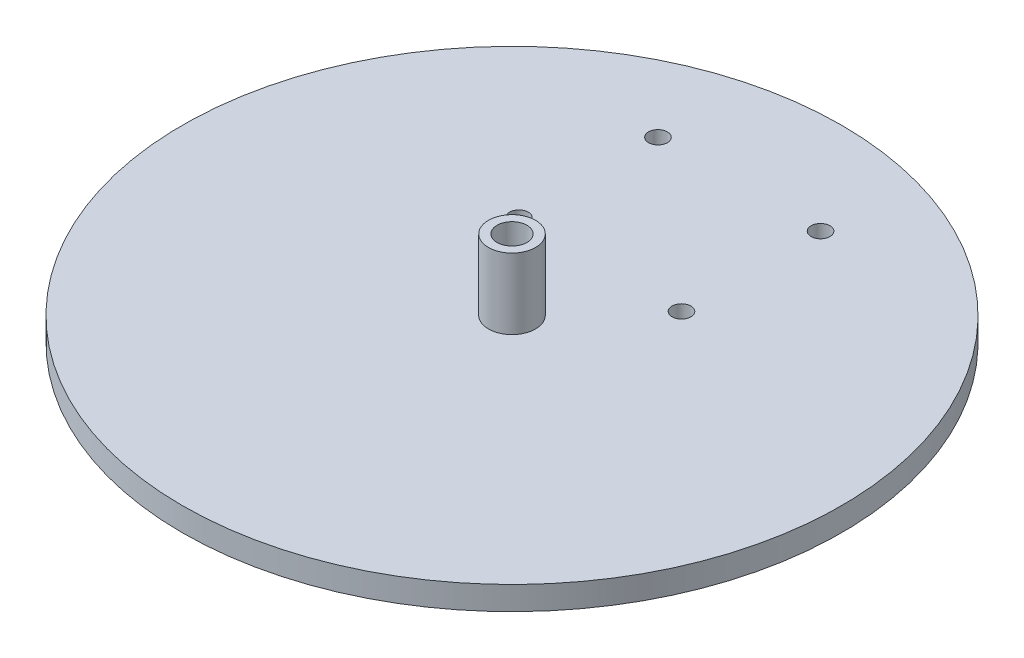
ISO-10303-21;
HEADER;
FILE_DESCRIPTION(('STEP AP214'),'2;1');
FILE_NAME('part.step','',(''),(''),'','','');
FILE_SCHEMA(('AUTOMOTIVE_DESIGN { 1 0 10303 214 1 1 1 1 }'));
ENDSEC;
DATA;
#1=APPLICATION_CONTEXT('core data for automotive mechanical design processes');
#2=APPLICATION_PROTOCOL_DEFINITION('international standard','automotive_design',2000,#1);
#3=PRODUCT_CONTEXT('',#1,'mechanical');
#4=PRODUCT('Part','Part','',(#3));
#5=PRODUCT_RELATED_PRODUCT_CATEGORY('part','',(#4));
#6=PRODUCT_DEFINITION_FORMATION('','',#4);
#7=PRODUCT_DEFINITION_CONTEXT('part definition',#1,'design');
#8=PRODUCT_DEFINITION('design','',#6,#7);
#9=PRODUCT_DEFINITION_SHAPE('','',#8);
#10=(LENGTH_UNIT() NAMED_UNIT(*) SI_UNIT(.MILLI.,.METRE.));
#11=(NAMED_UNIT(*) PLANE_ANGLE_UNIT() SI_UNIT($,.RADIAN.));
#12=(NAMED_UNIT(*) SI_UNIT($,.STERADIAN.) SOLID_ANGLE_UNIT());
#13=UNCERTAINTY_MEASURE_WITH_UNIT(LENGTH_MEASURE(1.E-05),#10,'distance_accuracy_value','');
#14=(GEOMETRIC_REPRESENTATION_CONTEXT(3) GLOBAL_UNCERTAINTY_ASSIGNED_CONTEXT((#13)) GLOBAL_UNIT_ASSIGNED_CONTEXT((#10,
#11,#12)) REPRESENTATION_CONTEXT('',''));
#15=CARTESIAN_POINT('',(0.,0.,0.));
#16=DIRECTION('',(0.,0.,1.));
#17=DIRECTION('',(1.,0.,0.));
#18=AXIS2_PLACEMENT_3D('',#15,#16,#17);
#19=CARTESIAN_POINT('',(0.,5.,0.));
#20=DIRECTION('',(0.,1.,0.));
#21=DIRECTION('',(0.,0.,1.));
#22=AXIS2_PLACEMENT_3D('',#19,#20,#21);
#23=PLANE('',#22);
#24=CARTESIAN_POINT('',(-17.2677669529664,5.,-18.7322330470337));
#25=DIRECTION('',(0.,1.,0.));
#26=DIRECTION('',(0.,0.,1.));
#27=AXIS2_PLACEMENT_3D('',#24,#25,#26);
#28=CIRCLE('',#27,2.);
#29=CARTESIAN_POINT('',(-17.2677669529664,5.,-16.7322330470337));
#30=VERTEX_POINT('',#29);
#31=EDGE_CURVE('E117',#30,#30,#28,.F.);
#32=ORIENTED_EDGE('',*,*,#31,.T.);
#33=EDGE_LOOP('',(#32));
#34=FACE_BOUND('',#33,.T.);
#35=CARTESIAN_POINT('',(17.2677669529664,5.,-18.7322330470337));
#36=DIRECTION('',(0.,1.,0.));
#37=DIRECTION('',(0.,0.,1.));
#38=AXIS2_PLACEMENT_3D('',#35,#36,#37);
#39=CIRCLE('',#38,2.);
#40=CARTESIAN_POINT('',(17.2677669529664,5.,-16.7322330470337));
#41=VERTEX_POINT('',#40);
#42=EDGE_CURVE('E121',#41,#41,#39,.T.);
#43=ORIENTED_EDGE('',*,*,#42,.F.);
#44=EDGE_LOOP('',(#43));
#45=FACE_BOUND('',#44,.T.);
#46=CARTESIAN_POINT('',(-17.2677669529664,5.,-48.2677669529663));
#47=DIRECTION('',(0.,1.,0.));
#48=DIRECTION('',(0.,0.,1.));
#49=AXIS2_PLACEMENT_3D('',#46,#47,#48);
#50=CIRCLE('',#49,2.);
#51=CARTESIAN_POINT('',(-17.2677669529664,5.,-46.2677669529663));
#52=VERTEX_POINT('',#51);
#53=EDGE_CURVE('E65',#52,#52,#50,.T.);
#54=ORIENTED_EDGE('',*,*,#53,.F.);
#55=EDGE_LOOP('',(#54));
#56=FACE_BOUND('',#55,.T.);
#57=CARTESIAN_POINT('',(0.,5.,0.));
#58=DIRECTION('',(0.,1.,0.));
#59=DIRECTION('',(0.,0.,1.));
#60=AXIS2_PLACEMENT_3D('',#57,#58,#59);
#61=CIRCLE('',#60,70.);
#62=CARTESIAN_POINT('',(0.,5.,70.));
#63=VERTEX_POINT('',#62);
#64=EDGE_CURVE('E10',#63,#63,#61,.T.);
#65=ORIENTED_EDGE('',*,*,#64,.T.);
#66=EDGE_LOOP('',(#65));
#67=FACE_BOUND('',#66,.T.);
#68=CARTESIAN_POINT('',(0.,5.,0.));
#69=DIRECTION('',(0.,1.,0.));
#70=DIRECTION('',(0.,0.,1.));
#71=AXIS2_PLACEMENT_3D('',#68,#69,#70);
#72=CIRCLE('',#71,5.);
#73=CARTESIAN_POINT('',(0.,5.,5.));
#74=VERTEX_POINT('',#73);
#75=EDGE_CURVE('E76',#74,#74,#72,.T.);
#76=ORIENTED_EDGE('',*,*,#75,.F.);
#77=EDGE_LOOP('',(#76));
#78=FACE_BOUND('',#77,.T.);
#79=CARTESIAN_POINT('',(17.2677669529664,5.,-48.2677669529663));
#80=DIRECTION('',(0.,1.,0.));
#81=DIRECTION('',(0.,0.,1.));
#82=AXIS2_PLACEMENT_3D('',#79,#80,#81);
#83=CIRCLE('',#82,2.);
#84=CARTESIAN_POINT('',(17.2677669529664,5.,-46.2677669529663));
#85=VERTEX_POINT('',#84);
#86=EDGE_CURVE('E129',#85,#85,#83,.F.);
#87=ORIENTED_EDGE('',*,*,#86,.T.);
#88=EDGE_LOOP('',(#87));
#89=FACE_BOUND('',#88,.T.);
#90=ADVANCED_FACE('F43',(#34,#45,#56,#67,#78,#89),#23,.T.);
#91=CARTESIAN_POINT('',(0.,0.,0.));
#92=DIRECTION('',(0.,1.,0.));
#93=DIRECTION('',(0.,0.,1.));
#94=AXIS2_PLACEMENT_3D('',#91,#92,#93);
#95=PLANE('',#94);
#96=CARTESIAN_POINT('',(17.2677669529664,0.,-18.7322330470337));
#97=DIRECTION('',(0.,1.,0.));
#98=DIRECTION('',(0.,0.,1.));
#99=AXIS2_PLACEMENT_3D('',#96,#97,#98);
#100=CIRCLE('',#99,2.);
#101=CARTESIAN_POINT('',(17.2677669529664,0.,-16.7322330470337));
#102=VERTEX_POINT('',#101);
#103=EDGE_CURVE('E64',#102,#102,#100,.T.);
#104=ORIENTED_EDGE('',*,*,#103,.T.);
#105=EDGE_LOOP('',(#104));
#106=FACE_BOUND('',#105,.T.);
#107=CARTESIAN_POINT('',(-17.2677669529664,0.,-48.2677669529663));
#108=DIRECTION('',(0.,1.,0.));
#109=DIRECTION('',(0.,0.,1.));
#110=AXIS2_PLACEMENT_3D('',#107,#108,#109);
#111=CIRCLE('',#110,2.);
#112=CARTESIAN_POINT('',(-17.2677669529664,0.,-46.2677669529663));
#113=VERTEX_POINT('',#112);
#114=EDGE_CURVE('E61',#113,#113,#111,.T.);
#115=ORIENTED_EDGE('',*,*,#114,.T.);
#116=EDGE_LOOP('',(#115));
#117=FACE_BOUND('',#116,.T.);
#118=CARTESIAN_POINT('',(0.,0.,0.));
#119=DIRECTION('',(0.,1.,0.));
#120=DIRECTION('',(0.,0.,1.));
#121=AXIS2_PLACEMENT_3D('',#118,#119,#120);
#122=CIRCLE('',#121,70.);
#123=CARTESIAN_POINT('',(0.,0.,70.));
#124=VERTEX_POINT('',#123);
#125=EDGE_CURVE('E51',#124,#124,#122,.T.);
#126=ORIENTED_EDGE('',*,*,#125,.F.);
#127=EDGE_LOOP('',(#126));
#128=FACE_BOUND('',#127,.T.);
#129=CARTESIAN_POINT('',(0.,0.,0.));
#130=DIRECTION('',(0.,1.,0.));
#131=DIRECTION('',(0.,0.,1.));
#132=AXIS2_PLACEMENT_3D('',#129,#130,#131);
#133=CIRCLE('',#132,3.175);
#134=CARTESIAN_POINT('',(0.,0.,3.175));
#135=VERTEX_POINT('',#134);
#136=EDGE_CURVE('E56',#135,#135,#133,.T.);
#137=ORIENTED_EDGE('',*,*,#136,.T.);
#138=EDGE_LOOP('',(#137));
#139=FACE_BOUND('',#138,.T.);
#140=CARTESIAN_POINT('',(-17.2677669529664,0.,-18.7322330470337));
#141=DIRECTION('',(0.,1.,0.));
#142=DIRECTION('',(0.,0.,1.));
#143=AXIS2_PLACEMENT_3D('',#140,#141,#142);
#144=CIRCLE('',#143,2.);
#145=CARTESIAN_POINT('',(-17.2677669529664,0.,-16.7322330470337));
#146=VERTEX_POINT('',#145);
#147=EDGE_CURVE('E67',#146,#146,#144,.F.);
#148=ORIENTED_EDGE('',*,*,#147,.F.);
#149=EDGE_LOOP('',(#148));
#150=FACE_BOUND('',#149,.T.);
#151=CARTESIAN_POINT('',(17.2677669529664,0.,-48.2677669529663));
#152=DIRECTION('',(0.,1.,0.));
#153=DIRECTION('',(0.,0.,1.));
#154=AXIS2_PLACEMENT_3D('',#151,#152,#153);
#155=CIRCLE('',#154,2.);
#156=CARTESIAN_POINT('',(17.2677669529664,0.,-46.2677669529663));
#157=VERTEX_POINT('',#156);
#158=EDGE_CURVE('E47',#157,#157,#155,.F.);
#159=ORIENTED_EDGE('',*,*,#158,.F.);
#160=EDGE_LOOP('',(#159));
#161=FACE_BOUND('',#160,.T.);
#162=ADVANCED_FACE('F91',(#106,#117,#128,#139,#150,#161),#95,.F.);
#163=CARTESIAN_POINT('',(0.,5.,0.));
#164=DIRECTION('',(0.,-1.,0.));
#165=DIRECTION('',(0.,0.,-1.));
#166=AXIS2_PLACEMENT_3D('',#163,#164,#165);
#167=CYLINDRICAL_SURFACE('',#166,70.);
#168=ORIENTED_EDGE('',*,*,#64,.F.);
#169=EDGE_LOOP('',(#168));
#170=FACE_BOUND('',#169,.T.);
#171=ORIENTED_EDGE('',*,*,#125,.T.);
#172=EDGE_LOOP('',(#171));
#173=FACE_BOUND('',#172,.T.);
#174=ADVANCED_FACE('F45',(#170,#173),#167,.T.);
#175=CARTESIAN_POINT('',(0.,5.,0.));
#176=DIRECTION('',(0.,-1.,0.));
#177=DIRECTION('',(0.,0.,-1.));
#178=AXIS2_PLACEMENT_3D('',#175,#176,#177);
#179=CYLINDRICAL_SURFACE('',#178,3.175);
#180=ORIENTED_EDGE('',*,*,#136,.F.);
#181=EDGE_LOOP('',(#180));
#182=FACE_BOUND('',#181,.T.);
#183=CARTESIAN_POINT('',(0.,20.,0.));
#184=DIRECTION('',(0.,1.,0.));
#185=DIRECTION('',(0.,0.,1.));
#186=AXIS2_PLACEMENT_3D('',#183,#184,#185);
#187=CIRCLE('',#186,3.175);
#188=CARTESIAN_POINT('',(0.,20.,3.175));
#189=VERTEX_POINT('',#188);
#190=EDGE_CURVE('E72',#189,#189,#187,.T.);
#191=ORIENTED_EDGE('',*,*,#190,.T.);
#192=EDGE_LOOP('',(#191));
#193=FACE_BOUND('',#192,.T.);
#194=ADVANCED_FACE('F94',(#182,#193),#179,.F.);
#195=CARTESIAN_POINT('',(0.,20.,0.));
#196=DIRECTION('',(0.,1.,0.));
#197=DIRECTION('',(0.,0.,1.));
#198=AXIS2_PLACEMENT_3D('',#195,#196,#197);
#199=PLANE('',#198);
#200=CARTESIAN_POINT('',(0.,20.,0.));
#201=DIRECTION('',(0.,1.,0.));
#202=DIRECTION('',(0.,0.,1.));
#203=AXIS2_PLACEMENT_3D('',#200,#201,#202);
#204=CIRCLE('',#203,5.);
#205=CARTESIAN_POINT('',(0.,20.,5.));
#206=VERTEX_POINT('',#205);
#207=EDGE_CURVE('E81',#206,#206,#204,.T.);
#208=ORIENTED_EDGE('',*,*,#207,.T.);
#209=EDGE_LOOP('',(#208));
#210=FACE_BOUND('',#209,.T.);
#211=ORIENTED_EDGE('',*,*,#190,.F.);
#212=EDGE_LOOP('',(#211));
#213=FACE_BOUND('',#212,.T.);
#214=ADVANCED_FACE('F96',(#210,#213),#199,.T.);
#215=CARTESIAN_POINT('',(0.,20.,0.));
#216=DIRECTION('',(0.,-1.,0.));
#217=DIRECTION('',(0.,0.,-1.));
#218=AXIS2_PLACEMENT_3D('',#215,#216,#217);
#219=CYLINDRICAL_SURFACE('',#218,5.);
#220=ORIENTED_EDGE('',*,*,#207,.F.);
#221=EDGE_LOOP('',(#220));
#222=FACE_BOUND('',#221,.T.);
#223=ORIENTED_EDGE('',*,*,#75,.T.);
#224=EDGE_LOOP('',(#223));
#225=FACE_BOUND('',#224,.T.);
#226=ADVANCED_FACE('F102',(#222,#225),#219,.T.);
#227=CARTESIAN_POINT('',(-17.2677669529664,-5.,-48.2677669529663));
#228=DIRECTION('',(0.,1.,0.));
#229=DIRECTION('',(0.,0.,1.));
#230=AXIS2_PLACEMENT_3D('',#227,#228,#229);
#231=CYLINDRICAL_SURFACE('',#230,2.);
#232=ORIENTED_EDGE('',*,*,#53,.T.);
#233=EDGE_LOOP('',(#232));
#234=FACE_BOUND('',#233,.T.);
#235=ORIENTED_EDGE('',*,*,#114,.F.);
#236=EDGE_LOOP('',(#235));
#237=FACE_BOUND('',#236,.T.);
#238=ADVANCED_FACE('F138',(#234,#237),#231,.F.);
#239=CARTESIAN_POINT('',(17.2677669529664,-5.,-18.7322330470337));
#240=DIRECTION('',(0.,1.,0.));
#241=DIRECTION('',(0.,0.,1.));
#242=AXIS2_PLACEMENT_3D('',#239,#240,#241);
#243=CYLINDRICAL_SURFACE('',#242,2.);
#244=ORIENTED_EDGE('',*,*,#42,.T.);
#245=EDGE_LOOP('',(#244));
#246=FACE_BOUND('',#245,.T.);
#247=ORIENTED_EDGE('',*,*,#103,.F.);
#248=EDGE_LOOP('',(#247));
#249=FACE_BOUND('',#248,.T.);
#250=ADVANCED_FACE('F134',(#246,#249),#243,.F.);
#251=CARTESIAN_POINT('',(-17.2677669529664,-5.,-18.7322330470337));
#252=DIRECTION('',(0.,1.,0.));
#253=DIRECTION('',(0.,0.,1.));
#254=AXIS2_PLACEMENT_3D('',#251,#252,#253);
#255=CYLINDRICAL_SURFACE('',#254,2.);
#256=ORIENTED_EDGE('',*,*,#31,.F.);
#257=EDGE_LOOP('',(#256));
#258=FACE_BOUND('',#257,.T.);
#259=ORIENTED_EDGE('',*,*,#147,.T.);
#260=EDGE_LOOP('',(#259));
#261=FACE_BOUND('',#260,.T.);
#262=ADVANCED_FACE('F137',(#258,#261),#255,.F.);
#263=CARTESIAN_POINT('',(17.2677669529664,-5.,-48.2677669529663));
#264=DIRECTION('',(0.,1.,0.));
#265=DIRECTION('',(0.,0.,1.));
#266=AXIS2_PLACEMENT_3D('',#263,#264,#265);
#267=CYLINDRICAL_SURFACE('',#266,2.);
#268=ORIENTED_EDGE('',*,*,#86,.F.);
#269=EDGE_LOOP('',(#268));
#270=FACE_BOUND('',#269,.T.);
#271=ORIENTED_EDGE('',*,*,#158,.T.);
#272=EDGE_LOOP('',(#271));
#273=FACE_BOUND('',#272,.T.);
#274=ADVANCED_FACE('F156',(#270,#273),#267,.F.);
#275=CLOSED_SHELL('',(#90,#162,#174,#194,#214,#226,#238,#250,#262,#274));
#276=MANIFOLD_SOLID_BREP('B2',#275);
#277=ADVANCED_BREP_SHAPE_REPRESENTATION('',(#18,#276),#14);
#278=SHAPE_DEFINITION_REPRESENTATION(#9,#277);
ENDSEC;
END-ISO-10303-21;
